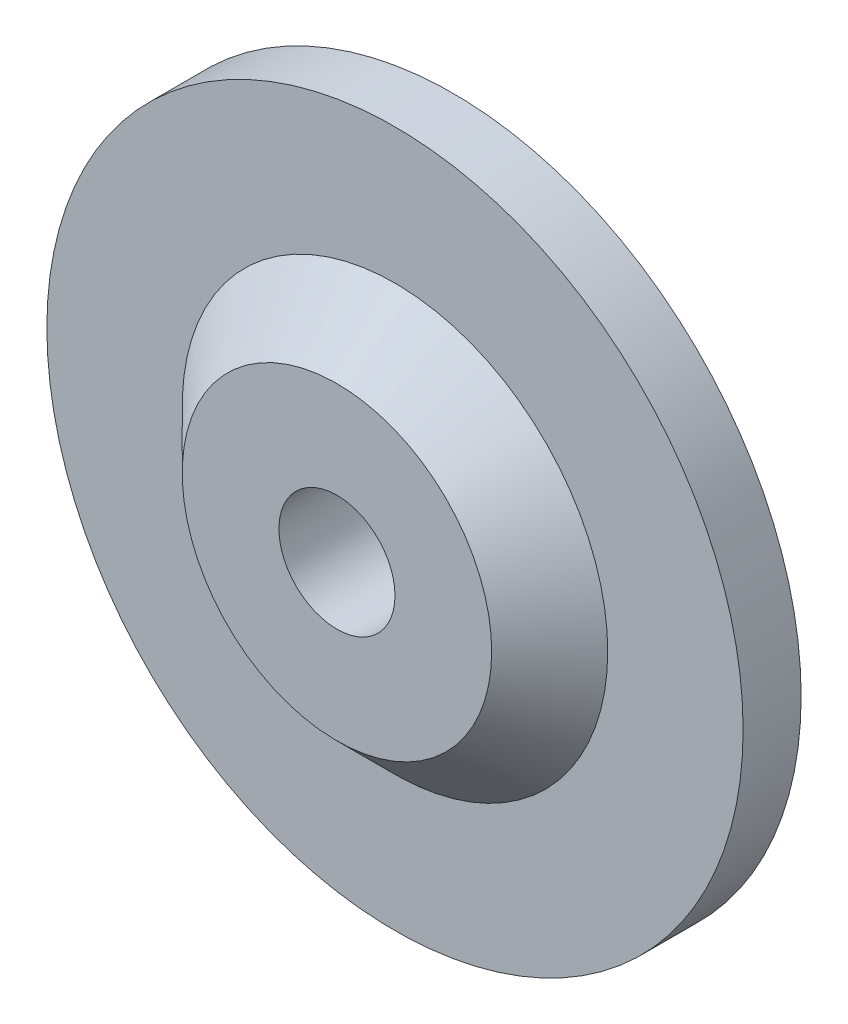
ISO-10303-21;
HEADER;
FILE_DESCRIPTION(('STEP AP214'),'2;1');
FILE_NAME('part.step','',(''),(''),'','','');
FILE_SCHEMA(('AUTOMOTIVE_DESIGN { 1 0 10303 214 1 1 1 1 }'));
ENDSEC;
DATA;
#1=APPLICATION_CONTEXT('core data for automotive mechanical design processes');
#2=APPLICATION_PROTOCOL_DEFINITION('international standard','automotive_design',2000,#1);
#3=PRODUCT_CONTEXT('',#1,'mechanical');
#4=PRODUCT('Part','Part','',(#3));
#5=PRODUCT_RELATED_PRODUCT_CATEGORY('part','',(#4));
#6=PRODUCT_DEFINITION_FORMATION('','',#4);
#7=PRODUCT_DEFINITION_CONTEXT('part definition',#1,'design');
#8=PRODUCT_DEFINITION('design','',#6,#7);
#9=PRODUCT_DEFINITION_SHAPE('','',#8);
#10=(LENGTH_UNIT() NAMED_UNIT(*) SI_UNIT(.MILLI.,.METRE.));
#11=(NAMED_UNIT(*) PLANE_ANGLE_UNIT() SI_UNIT($,.RADIAN.));
#12=(NAMED_UNIT(*) SI_UNIT($,.STERADIAN.) SOLID_ANGLE_UNIT());
#13=UNCERTAINTY_MEASURE_WITH_UNIT(LENGTH_MEASURE(1.E-05),#10,'distance_accuracy_value','');
#14=(GEOMETRIC_REPRESENTATION_CONTEXT(3) GLOBAL_UNCERTAINTY_ASSIGNED_CONTEXT((#13)) GLOBAL_UNIT_ASSIGNED_CONTEXT((#10,
#11,#12)) REPRESENTATION_CONTEXT('',''));
#15=CARTESIAN_POINT('',(0.,0.,0.));
#16=DIRECTION('',(0.,0.,1.));
#17=DIRECTION('',(1.,0.,0.));
#18=AXIS2_PLACEMENT_3D('',#15,#16,#17);
#19=CARTESIAN_POINT('',(0.,0.,3.));
#20=DIRECTION('',(0.,0.,1.));
#21=DIRECTION('',(1.,0.,0.));
#22=AXIS2_PLACEMENT_3D('',#19,#20,#21);
#23=PLANE('',#22);
#24=CARTESIAN_POINT('',(0.,0.,3.));
#25=DIRECTION('',(0.,0.,1.));
#26=DIRECTION('',(1.,0.,0.));
#27=AXIS2_PLACEMENT_3D('',#24,#25,#26);
#28=CIRCLE('',#27,10.9999999999999);
#29=CARTESIAN_POINT('',(10.9999999999999,0.,3.));
#30=VERTEX_POINT('',#29);
#31=EDGE_CURVE('E10',#30,#30,#28,.F.);
#32=ORIENTED_EDGE('',*,*,#31,.T.);
#33=EDGE_LOOP('',(#32));
#34=FACE_BOUND('',#33,.T.);
#35=CARTESIAN_POINT('',(0.,0.,3.));
#36=DIRECTION('',(0.,0.,1.));
#37=DIRECTION('',(1.,0.,0.));
#38=AXIS2_PLACEMENT_3D('',#35,#36,#37);
#39=CIRCLE('',#38,18.);
#40=CARTESIAN_POINT('',(18.,0.,3.));
#41=VERTEX_POINT('',#40);
#42=EDGE_CURVE('E42',#41,#41,#39,.T.);
#43=ORIENTED_EDGE('',*,*,#42,.T.);
#44=EDGE_LOOP('',(#43));
#45=FACE_BOUND('',#44,.T.);
#46=ADVANCED_FACE('F31',(#34,#45),#23,.T.);
#47=CARTESIAN_POINT('',(0.,0.,0.));
#48=DIRECTION('',(0.,0.,1.));
#49=DIRECTION('',(1.,0.,0.));
#50=AXIS2_PLACEMENT_3D('',#47,#48,#49);
#51=PLANE('',#50);
#52=CARTESIAN_POINT('',(0.,0.,0.));
#53=DIRECTION('',(0.,0.,1.));
#54=DIRECTION('',(1.,0.,0.));
#55=AXIS2_PLACEMENT_3D('',#52,#53,#54);
#56=CIRCLE('',#55,18.);
#57=CARTESIAN_POINT('',(18.,0.,0.));
#58=VERTEX_POINT('',#57);
#59=EDGE_CURVE('E46',#58,#58,#56,.T.);
#60=ORIENTED_EDGE('',*,*,#59,.F.);
#61=EDGE_LOOP('',(#60));
#62=FACE_BOUND('',#61,.T.);
#63=CARTESIAN_POINT('',(0.,0.,0.));
#64=DIRECTION('',(0.,0.,1.));
#65=DIRECTION('',(1.,0.,0.));
#66=AXIS2_PLACEMENT_3D('',#63,#64,#65);
#67=CIRCLE('',#66,3.);
#68=CARTESIAN_POINT('',(3.,0.,0.));
#69=VERTEX_POINT('',#68);
#70=EDGE_CURVE('E50',#69,#69,#67,.T.);
#71=ORIENTED_EDGE('',*,*,#70,.T.);
#72=EDGE_LOOP('',(#71));
#73=FACE_BOUND('',#72,.T.);
#74=ADVANCED_FACE('F72',(#62,#73),#51,.F.);
#75=CARTESIAN_POINT('',(0.,0.,3.));
#76=DIRECTION('',(0.,0.,-1.));
#77=DIRECTION('',(-1.,0.,0.));
#78=AXIS2_PLACEMENT_3D('',#75,#76,#77);
#79=CYLINDRICAL_SURFACE('',#78,18.);
#80=ORIENTED_EDGE('',*,*,#42,.F.);
#81=EDGE_LOOP('',(#80));
#82=FACE_BOUND('',#81,.T.);
#83=ORIENTED_EDGE('',*,*,#59,.T.);
#84=EDGE_LOOP('',(#83));
#85=FACE_BOUND('',#84,.T.);
#86=ADVANCED_FACE('F68',(#82,#85),#79,.T.);
#87=CARTESIAN_POINT('',(0.,0.,3.));
#88=DIRECTION('',(0.,0.,-1.));
#89=DIRECTION('',(-1.,0.,0.));
#90=AXIS2_PLACEMENT_3D('',#87,#88,#89);
#91=CYLINDRICAL_SURFACE('',#90,3.);
#92=ORIENTED_EDGE('',*,*,#70,.F.);
#93=EDGE_LOOP('',(#92));
#94=FACE_BOUND('',#93,.T.);
#95=CARTESIAN_POINT('',(0.,0.,6.));
#96=DIRECTION('',(0.,0.,1.));
#97=DIRECTION('',(1.,0.,0.));
#98=AXIS2_PLACEMENT_3D('',#95,#96,#97);
#99=CIRCLE('',#98,3.);
#100=CARTESIAN_POINT('',(3.,0.,6.));
#101=VERTEX_POINT('',#100);
#102=EDGE_CURVE('E54',#101,#101,#99,.T.);
#103=ORIENTED_EDGE('',*,*,#102,.T.);
#104=EDGE_LOOP('',(#103));
#105=FACE_BOUND('',#104,.T.);
#106=ADVANCED_FACE('F58',(#94,#105),#91,.F.);
#107=CARTESIAN_POINT('',(0.,0.,6.));
#108=DIRECTION('',(0.,0.,1.));
#109=DIRECTION('',(1.,0.,0.));
#110=AXIS2_PLACEMENT_3D('',#107,#108,#109);
#111=PLANE('',#110);
#112=CARTESIAN_POINT('',(0.,0.,6.));
#113=DIRECTION('',(0.,0.,1.));
#114=DIRECTION('',(1.,0.,0.));
#115=AXIS2_PLACEMENT_3D('',#112,#113,#114);
#116=CIRCLE('',#115,7.99999999999991);
#117=CARTESIAN_POINT('',(7.99999999999991,0.,6.));
#118=VERTEX_POINT('',#117);
#119=EDGE_CURVE('E38',#118,#118,#116,.T.);
#120=ORIENTED_EDGE('',*,*,#119,.T.);
#121=EDGE_LOOP('',(#120));
#122=FACE_BOUND('',#121,.T.);
#123=ORIENTED_EDGE('',*,*,#102,.F.);
#124=EDGE_LOOP('',(#123));
#125=FACE_BOUND('',#124,.T.);
#126=ADVANCED_FACE('F60',(#122,#125),#111,.T.);
#127=CARTESIAN_POINT('',(0.,0.,6.));
#128=DIRECTION('',(0.,0.,-1.));
#129=DIRECTION('',(-1.,0.,0.));
#130=AXIS2_PLACEMENT_3D('',#127,#128,#129);
#131=CONICAL_SURFACE('',#130,7.99999999999991,0.785398163397453);
#132=ORIENTED_EDGE('',*,*,#31,.F.);
#133=EDGE_LOOP('',(#132));
#134=FACE_BOUND('',#133,.T.);
#135=ORIENTED_EDGE('',*,*,#119,.F.);
#136=EDGE_LOOP('',(#135));
#137=FACE_BOUND('',#136,.T.);
#138=ADVANCED_FACE('F33',(#134,#137),#131,.T.);
#139=CLOSED_SHELL('',(#46,#74,#86,#106,#126,#138));
#140=MANIFOLD_SOLID_BREP('B2',#139);
#141=ADVANCED_BREP_SHAPE_REPRESENTATION('',(#18,#140),#14);
#142=SHAPE_DEFINITION_REPRESENTATION(#9,#141);
ENDSEC;
END-ISO-10303-21;
